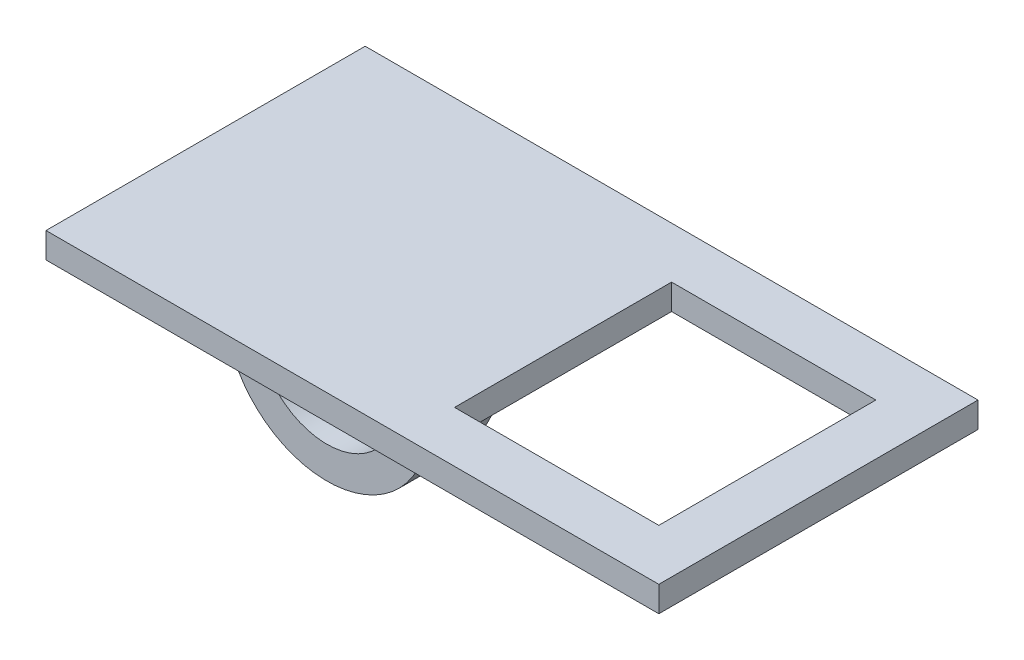
ISO-10303-21;
HEADER;
FILE_DESCRIPTION(('STEP AP214'),'2;1');
FILE_NAME('part.step','',(''),(''),'','','');
FILE_SCHEMA(('AUTOMOTIVE_DESIGN { 1 0 10303 214 1 1 1 1 }'));
ENDSEC;
DATA;
#1=APPLICATION_CONTEXT('core data for automotive mechanical design processes');
#2=APPLICATION_PROTOCOL_DEFINITION('international standard','automotive_design',2000,#1);
#3=PRODUCT_CONTEXT('',#1,'mechanical');
#4=PRODUCT('Part','Part','',(#3));
#5=PRODUCT_RELATED_PRODUCT_CATEGORY('part','',(#4));
#6=PRODUCT_DEFINITION_FORMATION('','',#4);
#7=PRODUCT_DEFINITION_CONTEXT('part definition',#1,'design');
#8=PRODUCT_DEFINITION('design','',#6,#7);
#9=PRODUCT_DEFINITION_SHAPE('','',#8);
#10=(LENGTH_UNIT() NAMED_UNIT(*) SI_UNIT(.MILLI.,.METRE.));
#11=(NAMED_UNIT(*) PLANE_ANGLE_UNIT() SI_UNIT($,.RADIAN.));
#12=(NAMED_UNIT(*) SI_UNIT($,.STERADIAN.) SOLID_ANGLE_UNIT());
#13=UNCERTAINTY_MEASURE_WITH_UNIT(LENGTH_MEASURE(1.E-05),#10,'distance_accuracy_value','');
#14=(GEOMETRIC_REPRESENTATION_CONTEXT(3) GLOBAL_UNCERTAINTY_ASSIGNED_CONTEXT((#13)) GLOBAL_UNIT_ASSIGNED_CONTEXT((#10,
#11,#12)) REPRESENTATION_CONTEXT('',''));
#15=CARTESIAN_POINT('',(0.,0.,0.));
#16=DIRECTION('',(0.,0.,1.));
#17=DIRECTION('',(1.,0.,0.));
#18=AXIS2_PLACEMENT_3D('',#15,#16,#17);
#19=CARTESIAN_POINT('',(-23.7775091583598,-2.30006043936903,2.5));
#20=DIRECTION('',(0.995353981388025,0.0962831851104194,0.));
#21=DIRECTION('',(-0.0962831851104194,0.995353981388025,0.));
#22=AXIS2_PLACEMENT_3D('',#19,#20,#21);
#23=PLANE('',#22);
#24=DIRECTION('',(0.0962831851104194,-0.995353981388025,0.));
#25=VECTOR('',#24,1.);
#26=CARTESIAN_POINT('',(-23.7775091583598,-2.30006043936903,-2.5));
#27=LINE('',#26,#25);
#28=CARTESIAN_POINT('',(-24.,0.,-2.5));
#29=VERTEX_POINT('',#28);
#30=CARTESIAN_POINT('',(-23.4837389348581,-5.33699114788647,-2.5));
#31=VERTEX_POINT('',#30);
#32=EDGE_CURVE('E127',#29,#31,#27,.T.);
#33=ORIENTED_EDGE('',*,*,#32,.T.);
#34=DIRECTION('',(0.,0.,-1.));
#35=VECTOR('',#34,1.);
#36=CARTESIAN_POINT('',(-23.4837389348581,-5.33699114788647,2.5));
#37=LINE('',#36,#35);
#38=CARTESIAN_POINT('',(-23.4837389348581,-5.33699114788647,2.5));
#39=VERTEX_POINT('',#38);
#40=EDGE_CURVE('E12',#39,#31,#37,.T.);
#41=ORIENTED_EDGE('',*,*,#40,.F.);
#42=DIRECTION('',(0.0962831851104194,-0.995353981388025,0.));
#43=VECTOR('',#42,1.);
#44=CARTESIAN_POINT('',(-23.7775091583598,-2.30006043936903,2.5));
#45=LINE('',#44,#43);
#46=CARTESIAN_POINT('',(-24.,0.,2.5));
#47=VERTEX_POINT('',#46);
#48=EDGE_CURVE('E143',#47,#39,#45,.T.);
#49=ORIENTED_EDGE('',*,*,#48,.F.);
#50=DIRECTION('',(0.,0.,-1.));
#51=VECTOR('',#50,1.);
#52=CARTESIAN_POINT('',(-24.,0.,2.5));
#53=LINE('',#52,#51);
#54=EDGE_CURVE('E61',#47,#29,#53,.T.);
#55=ORIENTED_EDGE('',*,*,#54,.T.);
#56=EDGE_LOOP('',(#33,#41,#49,#55));
#57=FACE_BOUND('',#56,.T.);
#58=ADVANCED_FACE('F45',(#57),#23,.F.);
#59=CARTESIAN_POINT('',(-20.,-5.,2.5));
#60=DIRECTION('',(0.,0.,-1.));
#61=DIRECTION('',(-1.,0.,0.));
#62=AXIS2_PLACEMENT_3D('',#59,#60,#61);
#63=CYLINDRICAL_SURFACE('',#62,3.5);
#64=CARTESIAN_POINT('',(-20.,-5.,-2.5));
#65=DIRECTION('',(0.,0.,1.));
#66=DIRECTION('',(1.,0.,0.));
#67=AXIS2_PLACEMENT_3D('',#64,#65,#66);
#68=CIRCLE('',#67,3.5);
#69=CARTESIAN_POINT('',(-19.6066026176593,-8.47782094127451,-2.5));
#70=VERTEX_POINT('',#69);
#71=EDGE_CURVE('E129',#31,#70,#68,.T.);
#72=ORIENTED_EDGE('',*,*,#71,.T.);
#73=DIRECTION('',(0.,0.,-1.));
#74=VECTOR('',#73,1.);
#75=CARTESIAN_POINT('',(-19.6066026176593,-8.47782094127451,2.5));
#76=LINE('',#75,#74);
#77=CARTESIAN_POINT('',(-19.6066026176593,-8.47782094127451,2.5));
#78=VERTEX_POINT('',#77);
#79=EDGE_CURVE('E53',#78,#70,#76,.T.);
#80=ORIENTED_EDGE('',*,*,#79,.F.);
#81=CARTESIAN_POINT('',(-20.,-5.,2.5));
#82=DIRECTION('',(0.,0.,1.));
#83=DIRECTION('',(1.,0.,0.));
#84=AXIS2_PLACEMENT_3D('',#81,#82,#83);
#85=CIRCLE('',#84,3.5);
#86=EDGE_CURVE('E90',#39,#78,#85,.T.);
#87=ORIENTED_EDGE('',*,*,#86,.F.);
#88=ORIENTED_EDGE('',*,*,#40,.T.);
#89=EDGE_LOOP('',(#72,#80,#87,#88));
#90=FACE_BOUND('',#89,.T.);
#91=ADVANCED_FACE('F163',(#90),#63,.T.);
#92=CARTESIAN_POINT('',(-12.,-6.,2.5));
#93=DIRECTION('',(0.,0.,-1.));
#94=DIRECTION('',(-1.,0.,0.));
#95=AXIS2_PLACEMENT_3D('',#92,#93,#94);
#96=CYLINDRICAL_SURFACE('',#95,8.);
#97=CARTESIAN_POINT('',(-12.,-6.,-2.5));
#98=DIRECTION('',(0.,0.,1.));
#99=DIRECTION('',(1.,0.,0.));
#100=AXIS2_PLACEMENT_3D('',#97,#98,#99);
#101=CIRCLE('',#100,8.);
#102=CARTESIAN_POINT('',(-4.86124543619493,-9.61084246094347,-2.5));
#103=VERTEX_POINT('',#102);
#104=EDGE_CURVE('E111',#70,#103,#101,.T.);
#105=ORIENTED_EDGE('',*,*,#104,.T.);
#106=DIRECTION('',(0.,0.,-1.));
#107=VECTOR('',#106,1.);
#108=CARTESIAN_POINT('',(-4.86124543619493,-9.61084246094347,2.5));
#109=LINE('',#108,#107);
#110=CARTESIAN_POINT('',(-4.86124543619493,-9.61084246094347,2.5));
#111=VERTEX_POINT('',#110);
#112=EDGE_CURVE('E108',#111,#103,#109,.T.);
#113=ORIENTED_EDGE('',*,*,#112,.F.);
#114=CARTESIAN_POINT('',(-12.,-6.,2.5));
#115=DIRECTION('',(0.,0.,1.));
#116=DIRECTION('',(1.,0.,0.));
#117=AXIS2_PLACEMENT_3D('',#114,#115,#116);
#118=CIRCLE('',#117,8.);
#119=EDGE_CURVE('E97',#78,#111,#118,.T.);
#120=ORIENTED_EDGE('',*,*,#119,.F.);
#121=ORIENTED_EDGE('',*,*,#79,.T.);
#122=EDGE_LOOP('',(#105,#113,#120,#121));
#123=FACE_BOUND('',#122,.T.);
#124=ADVANCED_FACE('F109',(#123),#96,.T.);
#125=CARTESIAN_POINT('',(0.,0.,2.5));
#126=DIRECTION('',(0.892344320475634,-0.451355307617934,0.));
#127=DIRECTION('',(0.451355307617934,0.892344320475634,0.));
#128=AXIS2_PLACEMENT_3D('',#125,#126,#127);
#129=PLANE('',#128);
#130=DIRECTION('',(-0.451355307617934,-0.892344320475634,0.));
#131=VECTOR('',#130,1.);
#132=CARTESIAN_POINT('',(0.,0.,-2.5));
#133=LINE('',#132,#131);
#134=CARTESIAN_POINT('',(0.,0.,-2.5));
#135=VERTEX_POINT('',#134);
#136=EDGE_CURVE('E132',#135,#103,#133,.T.);
#137=ORIENTED_EDGE('',*,*,#136,.F.);
#138=DIRECTION('',(0.,0.,-1.));
#139=VECTOR('',#138,1.);
#140=CARTESIAN_POINT('',(0.,0.,2.5));
#141=LINE('',#140,#139);
#142=CARTESIAN_POINT('',(0.,0.,2.5));
#143=VERTEX_POINT('',#142);
#144=EDGE_CURVE('E78',#143,#135,#141,.T.);
#145=ORIENTED_EDGE('',*,*,#144,.F.);
#146=DIRECTION('',(-0.451355307617934,-0.892344320475634,0.));
#147=VECTOR('',#146,1.);
#148=CARTESIAN_POINT('',(0.,0.,2.5));
#149=LINE('',#148,#147);
#150=EDGE_CURVE('E103',#143,#111,#149,.T.);
#151=ORIENTED_EDGE('',*,*,#150,.T.);
#152=ORIENTED_EDGE('',*,*,#112,.T.);
#153=EDGE_LOOP('',(#137,#145,#151,#152));
#154=FACE_BOUND('',#153,.T.);
#155=ADVANCED_FACE('F115',(#154),#129,.T.);
#156=CARTESIAN_POINT('',(-20.,-5.,2.5));
#157=DIRECTION('',(0.,0.,-1.));
#158=DIRECTION('',(-1.,0.,0.));
#159=AXIS2_PLACEMENT_3D('',#156,#157,#158);
#160=CYLINDRICAL_SURFACE('',#159,1.5);
#161=CARTESIAN_POINT('',(-20.,-5.,2.5));
#162=DIRECTION('',(0.,0.,1.));
#163=DIRECTION('',(1.,0.,0.));
#164=AXIS2_PLACEMENT_3D('',#161,#162,#163);
#165=CIRCLE('',#164,1.5);
#166=CARTESIAN_POINT('',(-18.5,-5.,2.5));
#167=VERTEX_POINT('',#166);
#168=EDGE_CURVE('E118',#167,#167,#165,.T.);
#169=ORIENTED_EDGE('',*,*,#168,.T.);
#170=EDGE_LOOP('',(#169));
#171=FACE_BOUND('',#170,.T.);
#172=CARTESIAN_POINT('',(-20.,-5.,-2.5));
#173=DIRECTION('',(0.,0.,1.));
#174=DIRECTION('',(1.,0.,0.));
#175=AXIS2_PLACEMENT_3D('',#172,#173,#174);
#176=CIRCLE('',#175,1.5);
#177=CARTESIAN_POINT('',(-18.5,-5.,-2.5));
#178=VERTEX_POINT('',#177);
#179=EDGE_CURVE('E137',#178,#178,#176,.T.);
#180=ORIENTED_EDGE('',*,*,#179,.F.);
#181=EDGE_LOOP('',(#180));
#182=FACE_BOUND('',#181,.T.);
#183=ADVANCED_FACE('F151',(#171,#182),#160,.F.);
#184=CARTESIAN_POINT('',(0.,0.,2.5));
#185=DIRECTION('',(0.,1.,0.));
#186=DIRECTION('',(0.,0.,1.));
#187=AXIS2_PLACEMENT_3D('',#184,#185,#186);
#188=PLANE('',#187);
#189=DIRECTION('',(1.,0.,0.));
#190=VECTOR('',#189,1.);
#191=CARTESIAN_POINT('',(0.,0.,-2.5));
#192=LINE('',#191,#190);
#193=EDGE_CURVE('E134',#29,#135,#192,.T.);
#194=ORIENTED_EDGE('',*,*,#193,.F.);
#195=ORIENTED_EDGE('',*,*,#54,.F.);
#196=DIRECTION('',(1.,0.,0.));
#197=VECTOR('',#196,1.);
#198=CARTESIAN_POINT('',(0.,0.,2.5));
#199=LINE('',#198,#197);
#200=EDGE_CURVE('E116',#47,#143,#199,.T.);
#201=ORIENTED_EDGE('',*,*,#200,.T.);
#202=ORIENTED_EDGE('',*,*,#144,.T.);
#203=EDGE_LOOP('',(#194,#195,#201,#202));
#204=FACE_BOUND('',#203,.T.);
#205=ADVANCED_FACE('F148',(#204),#188,.T.);
#206=CARTESIAN_POINT('',(-12.,-6.,2.5));
#207=DIRECTION('',(0.,0.,-1.));
#208=DIRECTION('',(-1.,0.,0.));
#209=AXIS2_PLACEMENT_3D('',#206,#207,#208);
#210=CYLINDRICAL_SURFACE('',#209,5.5);
#211=CARTESIAN_POINT('',(-12.,-6.,2.5));
#212=DIRECTION('',(0.,0.,1.));
#213=DIRECTION('',(1.,0.,0.));
#214=AXIS2_PLACEMENT_3D('',#211,#212,#213);
#215=CIRCLE('',#214,5.5);
#216=CARTESIAN_POINT('',(-6.5,-6.,2.5));
#217=VERTEX_POINT('',#216);
#218=EDGE_CURVE('E124',#217,#217,#215,.T.);
#219=ORIENTED_EDGE('',*,*,#218,.T.);
#220=EDGE_LOOP('',(#219));
#221=FACE_BOUND('',#220,.T.);
#222=CARTESIAN_POINT('',(-12.,-6.,-2.5));
#223=DIRECTION('',(0.,0.,1.));
#224=DIRECTION('',(1.,0.,0.));
#225=AXIS2_PLACEMENT_3D('',#222,#223,#224);
#226=CIRCLE('',#225,5.5);
#227=CARTESIAN_POINT('',(-6.5,-6.,-2.5));
#228=VERTEX_POINT('',#227);
#229=EDGE_CURVE('E140',#228,#228,#226,.T.);
#230=ORIENTED_EDGE('',*,*,#229,.F.);
#231=EDGE_LOOP('',(#230));
#232=FACE_BOUND('',#231,.T.);
#233=ADVANCED_FACE('F150',(#221,#232),#210,.F.);
#234=CARTESIAN_POINT('',(0.,0.,2.5));
#235=DIRECTION('',(0.,0.,1.));
#236=DIRECTION('',(1.,0.,0.));
#237=AXIS2_PLACEMENT_3D('',#234,#235,#236);
#238=PLANE('',#237);
#239=ORIENTED_EDGE('',*,*,#48,.T.);
#240=ORIENTED_EDGE('',*,*,#86,.T.);
#241=ORIENTED_EDGE('',*,*,#119,.T.);
#242=ORIENTED_EDGE('',*,*,#150,.F.);
#243=ORIENTED_EDGE('',*,*,#200,.F.);
#244=EDGE_LOOP('',(#239,#240,#241,#242,#243));
#245=FACE_BOUND('',#244,.T.);
#246=ORIENTED_EDGE('',*,*,#168,.F.);
#247=EDGE_LOOP('',(#246));
#248=FACE_BOUND('',#247,.T.);
#249=ORIENTED_EDGE('',*,*,#218,.F.);
#250=EDGE_LOOP('',(#249));
#251=FACE_BOUND('',#250,.T.);
#252=ADVANCED_FACE('F99',(#245,#248,#251),#238,.T.);
#253=CARTESIAN_POINT('',(0.,0.,-2.5));
#254=DIRECTION('',(0.,0.,1.));
#255=DIRECTION('',(1.,0.,0.));
#256=AXIS2_PLACEMENT_3D('',#253,#254,#255);
#257=PLANE('',#256);
#258=ORIENTED_EDGE('',*,*,#32,.F.);
#259=ORIENTED_EDGE('',*,*,#193,.T.);
#260=ORIENTED_EDGE('',*,*,#136,.T.);
#261=ORIENTED_EDGE('',*,*,#104,.F.);
#262=ORIENTED_EDGE('',*,*,#71,.F.);
#263=EDGE_LOOP('',(#258,#259,#260,#261,#262));
#264=FACE_BOUND('',#263,.T.);
#265=ORIENTED_EDGE('',*,*,#179,.T.);
#266=EDGE_LOOP('',(#265));
#267=FACE_BOUND('',#266,.T.);
#268=ORIENTED_EDGE('',*,*,#229,.T.);
#269=EDGE_LOOP('',(#268));
#270=FACE_BOUND('',#269,.T.);
#271=ADVANCED_FACE('F146',(#264,#267,#270),#257,.F.);
#272=CLOSED_SHELL('',(#58,#91,#124,#155,#183,#205,#233,#252,#271));
#273=MANIFOLD_SOLID_BREP('B2',#272);
#274=CARTESIAN_POINT('',(24.,2.,-12.5));
#275=DIRECTION('',(-1.,0.,0.));
#276=DIRECTION('',(0.,0.,1.));
#277=AXIS2_PLACEMENT_3D('',#274,#275,#276);
#278=PLANE('',#277);
#279=DIRECTION('',(0.,0.,-1.));
#280=VECTOR('',#279,1.);
#281=CARTESIAN_POINT('',(24.,0.,-12.5));
#282=LINE('',#281,#280);
#283=CARTESIAN_POINT('',(24.,0.,12.5));
#284=VERTEX_POINT('',#283);
#285=CARTESIAN_POINT('',(24.,0.,-12.5));
#286=VERTEX_POINT('',#285);
#287=EDGE_CURVE('E366',#284,#286,#282,.T.);
#288=ORIENTED_EDGE('',*,*,#287,.T.);
#289=DIRECTION('',(0.,-1.,0.));
#290=VECTOR('',#289,1.);
#291=CARTESIAN_POINT('',(24.,2.,-12.5));
#292=LINE('',#291,#290);
#293=CARTESIAN_POINT('',(24.,2.,-12.5));
#294=VERTEX_POINT('',#293);
#295=EDGE_CURVE('E43',#294,#286,#292,.T.);
#296=ORIENTED_EDGE('',*,*,#295,.F.);
#297=DIRECTION('',(0.,0.,-1.));
#298=VECTOR('',#297,1.);
#299=CARTESIAN_POINT('',(24.,2.,-12.5));
#300=LINE('',#299,#298);
#301=CARTESIAN_POINT('',(24.,2.,12.5));
#302=VERTEX_POINT('',#301);
#303=EDGE_CURVE('E367',#302,#294,#300,.T.);
#304=ORIENTED_EDGE('',*,*,#303,.F.);
#305=DIRECTION('',(0.,-1.,0.));
#306=VECTOR('',#305,1.);
#307=CARTESIAN_POINT('',(24.,2.,12.5));
#308=LINE('',#307,#306);
#309=EDGE_CURVE('E377',#302,#284,#308,.T.);
#310=ORIENTED_EDGE('',*,*,#309,.T.);
#311=EDGE_LOOP('',(#288,#296,#304,#310));
#312=FACE_BOUND('',#311,.T.);
#313=ADVANCED_FACE('F267',(#312),#278,.F.);
#314=CARTESIAN_POINT('',(-24.,2.,-12.5));
#315=DIRECTION('',(0.,0.,1.));
#316=DIRECTION('',(1.,0.,0.));
#317=AXIS2_PLACEMENT_3D('',#314,#315,#316);
#318=PLANE('',#317);
#319=DIRECTION('',(-1.,0.,0.));
#320=VECTOR('',#319,1.);
#321=CARTESIAN_POINT('',(-24.,0.,-12.5));
#322=LINE('',#321,#320);
#323=CARTESIAN_POINT('',(-24.,0.,-12.5));
#324=VERTEX_POINT('',#323);
#325=EDGE_CURVE('E380',#286,#324,#322,.T.);
#326=ORIENTED_EDGE('',*,*,#325,.T.);
#327=DIRECTION('',(0.,-1.,0.));
#328=VECTOR('',#327,1.);
#329=CARTESIAN_POINT('',(-24.,2.,-12.5));
#330=LINE('',#329,#328);
#331=CARTESIAN_POINT('',(-24.,2.,-12.5));
#332=VERTEX_POINT('',#331);
#333=EDGE_CURVE('E274',#332,#324,#330,.T.);
#334=ORIENTED_EDGE('',*,*,#333,.F.);
#335=DIRECTION('',(-1.,0.,0.));
#336=VECTOR('',#335,1.);
#337=CARTESIAN_POINT('',(-24.,2.,-12.5));
#338=LINE('',#337,#336);
#339=EDGE_CURVE('E370',#294,#332,#338,.T.);
#340=ORIENTED_EDGE('',*,*,#339,.F.);
#341=ORIENTED_EDGE('',*,*,#295,.T.);
#342=EDGE_LOOP('',(#326,#334,#340,#341));
#343=FACE_BOUND('',#342,.T.);
#344=ADVANCED_FACE('F408',(#343),#318,.F.);
#345=CARTESIAN_POINT('',(-24.,2.,-12.5));
#346=DIRECTION('',(1.,0.,0.));
#347=DIRECTION('',(0.,0.,-1.));
#348=AXIS2_PLACEMENT_3D('',#345,#346,#347);
#349=PLANE('',#348);
#350=DIRECTION('',(0.,0.,1.));
#351=VECTOR('',#350,1.);
#352=CARTESIAN_POINT('',(-24.,0.,-12.5));
#353=LINE('',#352,#351);
#354=CARTESIAN_POINT('',(-24.,0.,12.5));
#355=VERTEX_POINT('',#354);
#356=EDGE_CURVE('E382',#324,#355,#353,.T.);
#357=ORIENTED_EDGE('',*,*,#356,.T.);
#358=DIRECTION('',(0.,-1.,0.));
#359=VECTOR('',#358,1.);
#360=CARTESIAN_POINT('',(-24.,2.,12.5));
#361=LINE('',#360,#359);
#362=CARTESIAN_POINT('',(-24.,2.,12.5));
#363=VERTEX_POINT('',#362);
#364=EDGE_CURVE('E387',#363,#355,#361,.T.);
#365=ORIENTED_EDGE('',*,*,#364,.F.);
#366=DIRECTION('',(0.,0.,1.));
#367=VECTOR('',#366,1.);
#368=CARTESIAN_POINT('',(-24.,2.,-12.5));
#369=LINE('',#368,#367);
#370=EDGE_CURVE('E373',#332,#363,#369,.T.);
#371=ORIENTED_EDGE('',*,*,#370,.F.);
#372=ORIENTED_EDGE('',*,*,#333,.T.);
#373=EDGE_LOOP('',(#357,#365,#371,#372));
#374=FACE_BOUND('',#373,.T.);
#375=ADVANCED_FACE('F394',(#374),#349,.F.);
#376=CARTESIAN_POINT('',(-24.,2.,12.5));
#377=DIRECTION('',(0.,0.,-1.));
#378=DIRECTION('',(-1.,0.,0.));
#379=AXIS2_PLACEMENT_3D('',#376,#377,#378);
#380=PLANE('',#379);
#381=DIRECTION('',(1.,0.,0.));
#382=VECTOR('',#381,1.);
#383=CARTESIAN_POINT('',(-24.,0.,12.5));
#384=LINE('',#383,#382);
#385=EDGE_CURVE('E371',#355,#284,#384,.T.);
#386=ORIENTED_EDGE('',*,*,#385,.T.);
#387=ORIENTED_EDGE('',*,*,#309,.F.);
#388=DIRECTION('',(1.,0.,0.));
#389=VECTOR('',#388,1.);
#390=CARTESIAN_POINT('',(-24.,2.,12.5));
#391=LINE('',#390,#389);
#392=EDGE_CURVE('E375',#363,#302,#391,.T.);
#393=ORIENTED_EDGE('',*,*,#392,.F.);
#394=ORIENTED_EDGE('',*,*,#364,.T.);
#395=EDGE_LOOP('',(#386,#387,#393,#394));
#396=FACE_BOUND('',#395,.T.);
#397=ADVANCED_FACE('F401',(#396),#380,.F.);
#398=CARTESIAN_POINT('',(0.,2.,0.));
#399=DIRECTION('',(0.,1.,0.));
#400=DIRECTION('',(0.,0.,1.));
#401=AXIS2_PLACEMENT_3D('',#398,#399,#400);
#402=PLANE('',#401);
#403=DIRECTION('',(0.,0.,1.));
#404=VECTOR('',#403,1.);
#405=CARTESIAN_POINT('',(4.,2.,0.));
#406=LINE('',#405,#404);
#407=CARTESIAN_POINT('',(4.,2.,-8.5));
#408=VERTEX_POINT('',#407);
#409=CARTESIAN_POINT('',(4.,2.,8.5));
#410=VERTEX_POINT('',#409);
#411=EDGE_CURVE('E364',#408,#410,#406,.T.);
#412=ORIENTED_EDGE('',*,*,#411,.F.);
#413=DIRECTION('',(-1.,0.,0.));
#414=VECTOR('',#413,1.);
#415=CARTESIAN_POINT('',(0.,2.,-8.5));
#416=LINE('',#415,#414);
#417=CARTESIAN_POINT('',(20.,2.,-8.5));
#418=VERTEX_POINT('',#417);
#419=EDGE_CURVE('E357',#418,#408,#416,.T.);
#420=ORIENTED_EDGE('',*,*,#419,.F.);
#421=DIRECTION('',(0.,0.,-1.));
#422=VECTOR('',#421,1.);
#423=CARTESIAN_POINT('',(20.,2.,0.));
#424=LINE('',#423,#422);
#425=CARTESIAN_POINT('',(20.,2.,8.5));
#426=VERTEX_POINT('',#425);
#427=EDGE_CURVE('E337',#426,#418,#424,.T.);
#428=ORIENTED_EDGE('',*,*,#427,.F.);
#429=DIRECTION('',(1.,0.,0.));
#430=VECTOR('',#429,1.);
#431=CARTESIAN_POINT('',(0.,2.,8.5));
#432=LINE('',#431,#430);
#433=EDGE_CURVE('E362',#410,#426,#432,.T.);
#434=ORIENTED_EDGE('',*,*,#433,.F.);
#435=EDGE_LOOP('',(#412,#420,#428,#434));
#436=FACE_BOUND('',#435,.T.);
#437=ORIENTED_EDGE('',*,*,#303,.T.);
#438=ORIENTED_EDGE('',*,*,#339,.T.);
#439=ORIENTED_EDGE('',*,*,#370,.T.);
#440=ORIENTED_EDGE('',*,*,#392,.T.);
#441=EDGE_LOOP('',(#437,#438,#439,#440));
#442=FACE_BOUND('',#441,.T.);
#443=ADVANCED_FACE('F407',(#436,#442),#402,.T.);
#444=CARTESIAN_POINT('',(0.,0.,0.));
#445=DIRECTION('',(0.,1.,0.));
#446=DIRECTION('',(0.,0.,1.));
#447=AXIS2_PLACEMENT_3D('',#444,#445,#446);
#448=PLANE('',#447);
#449=DIRECTION('',(1.,0.,0.));
#450=VECTOR('',#449,1.);
#451=CARTESIAN_POINT('',(4.,0.,-8.5));
#452=LINE('',#451,#450);
#453=CARTESIAN_POINT('',(4.,0.,-8.5));
#454=VERTEX_POINT('',#453);
#455=CARTESIAN_POINT('',(20.,0.,-8.5));
#456=VERTEX_POINT('',#455);
#457=EDGE_CURVE('E343',#454,#456,#452,.T.);
#458=ORIENTED_EDGE('',*,*,#457,.F.);
#459=DIRECTION('',(0.,0.,-1.));
#460=VECTOR('',#459,1.);
#461=CARTESIAN_POINT('',(4.,0.,8.5));
#462=LINE('',#461,#460);
#463=CARTESIAN_POINT('',(4.,0.,8.5));
#464=VERTEX_POINT('',#463);
#465=EDGE_CURVE('E289',#464,#454,#462,.T.);
#466=ORIENTED_EDGE('',*,*,#465,.F.);
#467=DIRECTION('',(-1.,0.,0.));
#468=VECTOR('',#467,1.);
#469=CARTESIAN_POINT('',(4.,0.,8.5));
#470=LINE('',#469,#468);
#471=CARTESIAN_POINT('',(20.,0.,8.5));
#472=VERTEX_POINT('',#471);
#473=EDGE_CURVE('E350',#472,#464,#470,.T.);
#474=ORIENTED_EDGE('',*,*,#473,.F.);
#475=DIRECTION('',(0.,0.,1.));
#476=VECTOR('',#475,1.);
#477=CARTESIAN_POINT('',(20.,0.,8.5));
#478=LINE('',#477,#476);
#479=EDGE_CURVE('E334',#456,#472,#478,.T.);
#480=ORIENTED_EDGE('',*,*,#479,.F.);
#481=EDGE_LOOP('',(#458,#466,#474,#480));
#482=FACE_BOUND('',#481,.T.);
#483=ORIENTED_EDGE('',*,*,#287,.F.);
#484=ORIENTED_EDGE('',*,*,#385,.F.);
#485=ORIENTED_EDGE('',*,*,#356,.F.);
#486=ORIENTED_EDGE('',*,*,#325,.F.);
#487=EDGE_LOOP('',(#483,#484,#485,#486));
#488=FACE_BOUND('',#487,.T.);
#489=ADVANCED_FACE('F347',(#482,#488),#448,.F.);
#490=CARTESIAN_POINT('',(4.,4.,8.5));
#491=DIRECTION('',(-1.,0.,0.));
#492=DIRECTION('',(0.,0.,1.));
#493=AXIS2_PLACEMENT_3D('',#490,#491,#492);
#494=PLANE('',#493);
#495=ORIENTED_EDGE('',*,*,#411,.T.);
#496=DIRECTION('',(0.,-1.,0.));
#497=VECTOR('',#496,1.);
#498=CARTESIAN_POINT('',(4.,4.,8.5));
#499=LINE('',#498,#497);
#500=EDGE_CURVE('E355',#410,#464,#499,.T.);
#501=ORIENTED_EDGE('',*,*,#500,.T.);
#502=ORIENTED_EDGE('',*,*,#465,.T.);
#503=DIRECTION('',(0.,-1.,0.));
#504=VECTOR('',#503,1.);
#505=CARTESIAN_POINT('',(4.,4.,-8.5));
#506=LINE('',#505,#504);
#507=EDGE_CURVE('E340',#408,#454,#506,.T.);
#508=ORIENTED_EDGE('',*,*,#507,.F.);
#509=EDGE_LOOP('',(#495,#501,#502,#508));
#510=FACE_BOUND('',#509,.T.);
#511=ADVANCED_FACE('F420',(#510),#494,.F.);
#512=CARTESIAN_POINT('',(4.,4.,8.5));
#513=DIRECTION('',(0.,0.,1.));
#514=DIRECTION('',(1.,0.,0.));
#515=AXIS2_PLACEMENT_3D('',#512,#513,#514);
#516=PLANE('',#515);
#517=ORIENTED_EDGE('',*,*,#433,.T.);
#518=DIRECTION('',(0.,-1.,0.));
#519=VECTOR('',#518,1.);
#520=CARTESIAN_POINT('',(20.,4.,8.5));
#521=LINE('',#520,#519);
#522=EDGE_CURVE('E339',#426,#472,#521,.T.);
#523=ORIENTED_EDGE('',*,*,#522,.T.);
#524=ORIENTED_EDGE('',*,*,#473,.T.);
#525=ORIENTED_EDGE('',*,*,#500,.F.);
#526=EDGE_LOOP('',(#517,#523,#524,#525));
#527=FACE_BOUND('',#526,.T.);
#528=ADVANCED_FACE('F426',(#527),#516,.F.);
#529=CARTESIAN_POINT('',(20.,4.,8.5));
#530=DIRECTION('',(1.,0.,0.));
#531=DIRECTION('',(0.,0.,-1.));
#532=AXIS2_PLACEMENT_3D('',#529,#530,#531);
#533=PLANE('',#532);
#534=ORIENTED_EDGE('',*,*,#427,.T.);
#535=DIRECTION('',(0.,-1.,0.));
#536=VECTOR('',#535,1.);
#537=CARTESIAN_POINT('',(20.,4.,-8.5));
#538=LINE('',#537,#536);
#539=EDGE_CURVE('E281',#418,#456,#538,.T.);
#540=ORIENTED_EDGE('',*,*,#539,.T.);
#541=ORIENTED_EDGE('',*,*,#479,.T.);
#542=ORIENTED_EDGE('',*,*,#522,.F.);
#543=EDGE_LOOP('',(#534,#540,#541,#542));
#544=FACE_BOUND('',#543,.T.);
#545=ADVANCED_FACE('F331',(#544),#533,.F.);
#546=CARTESIAN_POINT('',(4.,4.,-8.5));
#547=DIRECTION('',(0.,0.,-1.));
#548=DIRECTION('',(-1.,0.,0.));
#549=AXIS2_PLACEMENT_3D('',#546,#547,#548);
#550=PLANE('',#549);
#551=ORIENTED_EDGE('',*,*,#419,.T.);
#552=ORIENTED_EDGE('',*,*,#507,.T.);
#553=ORIENTED_EDGE('',*,*,#457,.T.);
#554=ORIENTED_EDGE('',*,*,#539,.F.);
#555=EDGE_LOOP('',(#551,#552,#553,#554));
#556=FACE_BOUND('',#555,.T.);
#557=ADVANCED_FACE('F344',(#556),#550,.F.);
#558=CLOSED_SHELL('',(#313,#344,#375,#397,#443,#489,#511,#528,#545,#557));
#559=MANIFOLD_SOLID_BREP('B6',#558);
#560=ADVANCED_BREP_SHAPE_REPRESENTATION('',(#18,#273,#559),#14);
#561=SHAPE_DEFINITION_REPRESENTATION(#9,#560);
ENDSEC;
END-ISO-10303-21;
